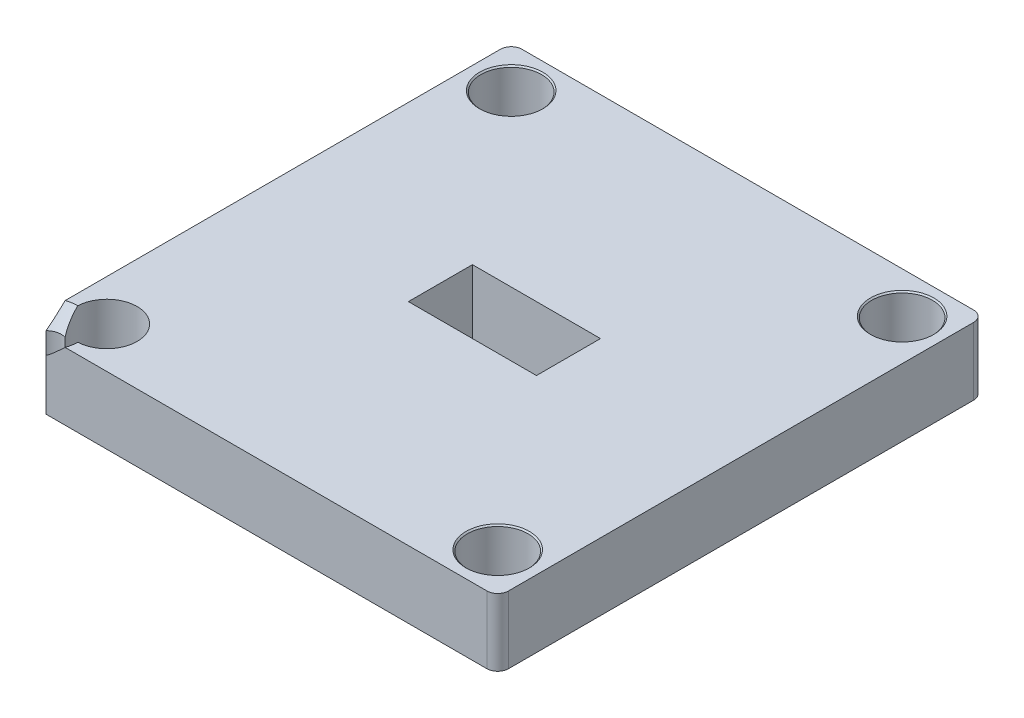
ISO-10303-21;
HEADER;
FILE_DESCRIPTION(('STEP AP214'),'2;1');
FILE_NAME('part.step','',(''),(''),'','','');
FILE_SCHEMA(('AUTOMOTIVE_DESIGN { 1 0 10303 214 1 1 1 1 }'));
ENDSEC;
DATA;
#1=APPLICATION_CONTEXT('core data for automotive mechanical design processes');
#2=APPLICATION_PROTOCOL_DEFINITION('international standard','automotive_design',2000,#1);
#3=PRODUCT_CONTEXT('',#1,'mechanical');
#4=PRODUCT('Part','Part','',(#3));
#5=PRODUCT_RELATED_PRODUCT_CATEGORY('part','',(#4));
#6=PRODUCT_DEFINITION_FORMATION('','',#4);
#7=PRODUCT_DEFINITION_CONTEXT('part definition',#1,'design');
#8=PRODUCT_DEFINITION('design','',#6,#7);
#9=PRODUCT_DEFINITION_SHAPE('','',#8);
#10=(LENGTH_UNIT() NAMED_UNIT(*) SI_UNIT(.MILLI.,.METRE.));
#11=(NAMED_UNIT(*) PLANE_ANGLE_UNIT() SI_UNIT($,.RADIAN.));
#12=(NAMED_UNIT(*) SI_UNIT($,.STERADIAN.) SOLID_ANGLE_UNIT());
#13=UNCERTAINTY_MEASURE_WITH_UNIT(LENGTH_MEASURE(1.E-05),#10,'distance_accuracy_value','');
#14=(GEOMETRIC_REPRESENTATION_CONTEXT(3) GLOBAL_UNCERTAINTY_ASSIGNED_CONTEXT((#13)) GLOBAL_UNIT_ASSIGNED_CONTEXT((#10,
#11,#12)) REPRESENTATION_CONTEXT('',''));
#15=CARTESIAN_POINT('',(0.,0.,0.));
#16=DIRECTION('',(0.,0.,1.));
#17=DIRECTION('',(1.,0.,0.));
#18=AXIS2_PLACEMENT_3D('',#15,#16,#17);
#19=CARTESIAN_POINT('',(-33.5,10.,-34.5));
#20=DIRECTION('',(0.,-1.,0.));
#21=DIRECTION('',(0.,0.,-1.));
#22=AXIS2_PLACEMENT_3D('',#19,#20,#21);
#23=PLANE('',#22);
#24=CARTESIAN_POINT('',(-29.,10.,-30.));
#25=DIRECTION('',(0.,1.,0.));
#26=DIRECTION('',(0.,0.,1.));
#27=AXIS2_PLACEMENT_3D('',#24,#25,#26);
#28=CIRCLE('',#27,4.7);
#29=CARTESIAN_POINT('',(-29.,10.,-25.3));
#30=VERTEX_POINT('',#29);
#31=EDGE_CURVE('E399',#30,#30,#28,.T.);
#32=ORIENTED_EDGE('',*,*,#31,.F.);
#33=EDGE_LOOP('',(#32));
#34=FACE_BOUND('',#33,.T.);
#35=CARTESIAN_POINT('',(29.,10.,-30.));
#36=DIRECTION('',(0.,1.,0.));
#37=DIRECTION('',(0.,0.,1.));
#38=AXIS2_PLACEMENT_3D('',#35,#36,#37);
#39=CIRCLE('',#38,4.7);
#40=CARTESIAN_POINT('',(29.,10.,-25.3));
#41=VERTEX_POINT('',#40);
#42=EDGE_CURVE('E393',#41,#41,#39,.T.);
#43=ORIENTED_EDGE('',*,*,#42,.F.);
#44=EDGE_LOOP('',(#43));
#45=FACE_BOUND('',#44,.T.);
#46=DIRECTION('',(0.,0.,-1.));
#47=VECTOR('',#46,1.);
#48=CARTESIAN_POINT('',(9.5,10.,4.75));
#49=LINE('',#48,#47);
#50=CARTESIAN_POINT('',(9.5,10.,4.75));
#51=VERTEX_POINT('',#50);
#52=CARTESIAN_POINT('',(9.5,10.,-4.75));
#53=VERTEX_POINT('',#52);
#54=EDGE_CURVE('E337',#51,#53,#49,.T.);
#55=ORIENTED_EDGE('',*,*,#54,.F.);
#56=DIRECTION('',(1.,0.,0.));
#57=VECTOR('',#56,1.);
#58=CARTESIAN_POINT('',(-9.5,10.,4.75));
#59=LINE('',#58,#57);
#60=CARTESIAN_POINT('',(-9.5,10.,4.75));
#61=VERTEX_POINT('',#60);
#62=EDGE_CURVE('E345',#61,#51,#59,.T.);
#63=ORIENTED_EDGE('',*,*,#62,.F.);
#64=DIRECTION('',(0.,0.,1.));
#65=VECTOR('',#64,1.);
#66=CARTESIAN_POINT('',(-9.5,10.,4.75));
#67=LINE('',#66,#65);
#68=CARTESIAN_POINT('',(-9.5,10.,-4.75));
#69=VERTEX_POINT('',#68);
#70=EDGE_CURVE('E342',#69,#61,#67,.T.);
#71=ORIENTED_EDGE('',*,*,#70,.F.);
#72=DIRECTION('',(-1.,0.,0.));
#73=VECTOR('',#72,1.);
#74=CARTESIAN_POINT('',(-9.5,10.,-4.75));
#75=LINE('',#74,#73);
#76=EDGE_CURVE('E339',#53,#69,#75,.T.);
#77=ORIENTED_EDGE('',*,*,#76,.F.);
#78=EDGE_LOOP('',(#55,#63,#71,#77));
#79=FACE_BOUND('',#78,.T.);
#80=CARTESIAN_POINT('',(29.0000000000008,10.,30.));
#81=DIRECTION('',(0.,1.,0.));
#82=DIRECTION('',(0.,0.,1.));
#83=AXIS2_PLACEMENT_3D('',#80,#81,#82);
#84=CIRCLE('',#83,4.7);
#85=CARTESIAN_POINT('',(29.0000000000008,10.,34.7));
#86=VERTEX_POINT('',#85);
#87=EDGE_CURVE('E164',#86,#86,#84,.T.);
#88=ORIENTED_EDGE('',*,*,#87,.F.);
#89=EDGE_LOOP('',(#88));
#90=FACE_BOUND('',#89,.T.);
#91=CARTESIAN_POINT('',(-33.5,10.,34.5));
#92=DIRECTION('',(0.,1.,0.));
#93=DIRECTION('',(0.,0.,1.));
#94=AXIS2_PLACEMENT_3D('',#91,#92,#93);
#95=CIRCLE('',#94,4.7);
#96=CARTESIAN_POINT('',(-29.0807240412031,10.,36.1));
#97=VERTEX_POINT('',#96);
#98=CARTESIAN_POINT('',(-28.8000021033821,10.,34.4955534521735));
#99=VERTEX_POINT('',#98);
#100=EDGE_CURVE('E57',#97,#99,#95,.T.);
#101=ORIENTED_EDGE('',*,*,#100,.F.);
#102=DIRECTION('',(1.,0.,0.));
#103=VECTOR('',#102,1.);
#104=CARTESIAN_POINT('',(33.5,10.,36.1));
#105=LINE('',#104,#103);
#106=CARTESIAN_POINT('',(33.5,10.,36.1));
#107=VERTEX_POINT('',#106);
#108=EDGE_CURVE('E163',#97,#107,#105,.T.);
#109=ORIENTED_EDGE('',*,*,#108,.T.);
#110=CARTESIAN_POINT('',(33.5,10.,34.5));
#111=DIRECTION('',(0.,1.,0.));
#112=DIRECTION('',(0.,0.,1.));
#113=AXIS2_PLACEMENT_3D('',#110,#111,#112);
#114=CIRCLE('',#113,1.6);
#115=CARTESIAN_POINT('',(35.1,10.,34.5));
#116=VERTEX_POINT('',#115);
#117=EDGE_CURVE('E374',#107,#116,#114,.T.);
#118=ORIENTED_EDGE('',*,*,#117,.T.);
#119=DIRECTION('',(0.,0.,-1.));
#120=VECTOR('',#119,1.);
#121=CARTESIAN_POINT('',(35.1,10.,34.5));
#122=LINE('',#121,#120);
#123=CARTESIAN_POINT('',(35.1,10.,-34.5));
#124=VERTEX_POINT('',#123);
#125=EDGE_CURVE('E292',#116,#124,#122,.T.);
#126=ORIENTED_EDGE('',*,*,#125,.T.);
#127=CARTESIAN_POINT('',(33.5,10.,-34.5));
#128=DIRECTION('',(0.,1.,0.));
#129=DIRECTION('',(0.,0.,1.));
#130=AXIS2_PLACEMENT_3D('',#127,#128,#129);
#131=CIRCLE('',#130,1.59999999999999);
#132=CARTESIAN_POINT('',(33.5,10.,-36.1));
#133=VERTEX_POINT('',#132);
#134=EDGE_CURVE('E377',#124,#133,#131,.T.);
#135=ORIENTED_EDGE('',*,*,#134,.T.);
#136=DIRECTION('',(-1.,0.,0.));
#137=VECTOR('',#136,1.);
#138=CARTESIAN_POINT('',(33.5,10.,-36.1));
#139=LINE('',#138,#137);
#140=CARTESIAN_POINT('',(-33.5,10.,-36.1));
#141=VERTEX_POINT('',#140);
#142=EDGE_CURVE('E309',#133,#141,#139,.T.);
#143=ORIENTED_EDGE('',*,*,#142,.T.);
#144=CARTESIAN_POINT('',(-33.5,10.,-34.5));
#145=DIRECTION('',(0.,1.,0.));
#146=DIRECTION('',(0.,0.,-1.));
#147=AXIS2_PLACEMENT_3D('',#144,#145,#146);
#148=CIRCLE('',#147,1.59999999999999);
#149=CARTESIAN_POINT('',(-35.1,10.,-34.5));
#150=VERTEX_POINT('',#149);
#151=EDGE_CURVE('E304',#141,#150,#148,.T.);
#152=ORIENTED_EDGE('',*,*,#151,.T.);
#153=DIRECTION('',(0.,0.,1.));
#154=VECTOR('',#153,1.);
#155=CARTESIAN_POINT('',(-35.1,10.,34.5));
#156=LINE('',#155,#154);
#157=CARTESIAN_POINT('',(-35.1,10.,30.0807240412031));
#158=VERTEX_POINT('',#157);
#159=EDGE_CURVE('E370',#150,#158,#156,.T.);
#160=ORIENTED_EDGE('',*,*,#159,.T.);
#161=CARTESIAN_POINT('',(-33.4955534521726,10.,29.8000021033821));
#162=VERTEX_POINT('',#161);
#163=EDGE_CURVE('E392',#162,#158,#95,.T.);
#164=ORIENTED_EDGE('',*,*,#163,.F.);
#165=CARTESIAN_POINT('',(-28.9999999999992,10.,30.));
#166=DIRECTION('',(0.,1.,0.));
#167=DIRECTION('',(0.,0.,1.));
#168=AXIS2_PLACEMENT_3D('',#165,#166,#167);
#169=CIRCLE('',#168,4.5);
#170=EDGE_CURVE('E321',#99,#162,#169,.T.);
#171=ORIENTED_EDGE('',*,*,#170,.F.);
#172=EDGE_LOOP('',(#101,#109,#118,#126,#135,#143,#152,#160,#164,#171));
#173=FACE_BOUND('',#172,.T.);
#174=ADVANCED_FACE('F33',(#34,#45,#79,#90,#173),#23,.F.);
#175=CARTESIAN_POINT('',(-33.5,0.,-34.5));
#176=DIRECTION('',(0.,-1.,0.));
#177=DIRECTION('',(0.,0.,-1.));
#178=AXIS2_PLACEMENT_3D('',#175,#176,#177);
#179=PLANE('',#178);
#180=CARTESIAN_POINT('',(29.0000000000008,0.,30.));
#181=DIRECTION('',(0.,1.,0.));
#182=DIRECTION('',(0.,0.,1.));
#183=AXIS2_PLACEMENT_3D('',#180,#181,#182);
#184=CIRCLE('',#183,4.5);
#185=CARTESIAN_POINT('',(29.0000000000008,0.,34.5));
#186=VERTEX_POINT('',#185);
#187=EDGE_CURVE('E326',#186,#186,#184,.T.);
#188=ORIENTED_EDGE('',*,*,#187,.T.);
#189=EDGE_LOOP('',(#188));
#190=FACE_BOUND('',#189,.T.);
#191=CARTESIAN_POINT('',(-29.,0.,-30.));
#192=DIRECTION('',(0.,1.,0.));
#193=DIRECTION('',(0.,0.,1.));
#194=AXIS2_PLACEMENT_3D('',#191,#192,#193);
#195=CIRCLE('',#194,4.5);
#196=CARTESIAN_POINT('',(-29.,0.,-25.5));
#197=VERTEX_POINT('',#196);
#198=EDGE_CURVE('E333',#197,#197,#195,.T.);
#199=ORIENTED_EDGE('',*,*,#198,.T.);
#200=EDGE_LOOP('',(#199));
#201=FACE_BOUND('',#200,.T.);
#202=DIRECTION('',(1.,0.,0.));
#203=VECTOR('',#202,1.);
#204=CARTESIAN_POINT('',(-9.5,0.,4.75));
#205=LINE('',#204,#203);
#206=CARTESIAN_POINT('',(-9.5,0.,4.75));
#207=VERTEX_POINT('',#206);
#208=CARTESIAN_POINT('',(9.49999999999999,0.,4.75));
#209=VERTEX_POINT('',#208);
#210=EDGE_CURVE('E340',#207,#209,#205,.T.);
#211=ORIENTED_EDGE('',*,*,#210,.T.);
#212=DIRECTION('',(0.,0.,-1.));
#213=VECTOR('',#212,1.);
#214=CARTESIAN_POINT('',(9.5,0.,4.75));
#215=LINE('',#214,#213);
#216=CARTESIAN_POINT('',(9.5,0.,-4.75));
#217=VERTEX_POINT('',#216);
#218=EDGE_CURVE('E336',#209,#217,#215,.T.);
#219=ORIENTED_EDGE('',*,*,#218,.T.);
#220=DIRECTION('',(-1.,0.,0.));
#221=VECTOR('',#220,1.);
#222=CARTESIAN_POINT('',(-9.5,0.,-4.75));
#223=LINE('',#222,#221);
#224=CARTESIAN_POINT('',(-9.5,0.,-4.75));
#225=VERTEX_POINT('',#224);
#226=EDGE_CURVE('E350',#217,#225,#223,.T.);
#227=ORIENTED_EDGE('',*,*,#226,.T.);
#228=DIRECTION('',(0.,0.,1.));
#229=VECTOR('',#228,1.);
#230=CARTESIAN_POINT('',(-9.5,0.,4.75));
#231=LINE('',#230,#229);
#232=EDGE_CURVE('E353',#225,#207,#231,.T.);
#233=ORIENTED_EDGE('',*,*,#232,.T.);
#234=EDGE_LOOP('',(#211,#219,#227,#233));
#235=FACE_BOUND('',#234,.T.);
#236=CARTESIAN_POINT('',(29.,0.,-30.));
#237=DIRECTION('',(0.,1.,0.));
#238=DIRECTION('',(0.,0.,1.));
#239=AXIS2_PLACEMENT_3D('',#236,#237,#238);
#240=CIRCLE('',#239,4.5);
#241=CARTESIAN_POINT('',(29.,0.,-25.5));
#242=VERTEX_POINT('',#241);
#243=EDGE_CURVE('E330',#242,#242,#240,.T.);
#244=ORIENTED_EDGE('',*,*,#243,.T.);
#245=EDGE_LOOP('',(#244));
#246=FACE_BOUND('',#245,.T.);
#247=DIRECTION('',(1.,0.,0.));
#248=VECTOR('',#247,1.);
#249=CARTESIAN_POINT('',(33.5,0.,36.1));
#250=LINE('',#249,#248);
#251=CARTESIAN_POINT('',(-31.9180707980444,0.,36.1));
#252=VERTEX_POINT('',#251);
#253=CARTESIAN_POINT('',(33.5,0.,36.1));
#254=VERTEX_POINT('',#253);
#255=EDGE_CURVE('E288',#252,#254,#250,.T.);
#256=ORIENTED_EDGE('',*,*,#255,.F.);
#257=CARTESIAN_POINT('',(-33.5,0.,34.5));
#258=DIRECTION('',(0.,1.,0.));
#259=DIRECTION('',(0.,0.,1.));
#260=AXIS2_PLACEMENT_3D('',#257,#258,#259);
#261=CIRCLE('',#260,2.25);
#262=CARTESIAN_POINT('',(-31.3496324437633,0.,33.8378675562363));
#263=VERTEX_POINT('',#262);
#264=EDGE_CURVE('E151',#252,#263,#261,.T.);
#265=ORIENTED_EDGE('',*,*,#264,.T.);
#266=CARTESIAN_POINT('',(-28.9999999999992,0.,30.));
#267=DIRECTION('',(0.,1.,0.));
#268=DIRECTION('',(0.,0.,1.));
#269=AXIS2_PLACEMENT_3D('',#266,#267,#268);
#270=CIRCLE('',#269,4.5);
#271=CARTESIAN_POINT('',(-32.8378675562359,0.,32.3496324437634));
#272=VERTEX_POINT('',#271);
#273=EDGE_CURVE('E317',#263,#272,#270,.T.);
#274=ORIENTED_EDGE('',*,*,#273,.T.);
#275=CARTESIAN_POINT('',(-35.1,0.,32.9180707980443));
#276=VERTEX_POINT('',#275);
#277=EDGE_CURVE('E158',#272,#276,#261,.T.);
#278=ORIENTED_EDGE('',*,*,#277,.T.);
#279=DIRECTION('',(0.,0.,1.));
#280=VECTOR('',#279,1.);
#281=CARTESIAN_POINT('',(-35.1,0.,34.5));
#282=LINE('',#281,#280);
#283=CARTESIAN_POINT('',(-35.1,0.,-34.5));
#284=VERTEX_POINT('',#283);
#285=EDGE_CURVE('E382',#284,#276,#282,.T.);
#286=ORIENTED_EDGE('',*,*,#285,.F.);
#287=CARTESIAN_POINT('',(-33.5,0.,-34.5));
#288=DIRECTION('',(0.,1.,0.));
#289=DIRECTION('',(0.,0.,-1.));
#290=AXIS2_PLACEMENT_3D('',#287,#288,#289);
#291=CIRCLE('',#290,1.59999999999999);
#292=CARTESIAN_POINT('',(-33.5,0.,-36.1));
#293=VERTEX_POINT('',#292);
#294=EDGE_CURVE('E367',#293,#284,#291,.T.);
#295=ORIENTED_EDGE('',*,*,#294,.F.);
#296=DIRECTION('',(-1.,0.,0.));
#297=VECTOR('',#296,1.);
#298=CARTESIAN_POINT('',(33.5,0.,-36.1));
#299=LINE('',#298,#297);
#300=CARTESIAN_POINT('',(33.5,0.,-36.1));
#301=VERTEX_POINT('',#300);
#302=EDGE_CURVE('E299',#301,#293,#299,.T.);
#303=ORIENTED_EDGE('',*,*,#302,.F.);
#304=CARTESIAN_POINT('',(33.5,0.,-34.5));
#305=DIRECTION('',(0.,1.,0.));
#306=DIRECTION('',(0.,0.,1.));
#307=AXIS2_PLACEMENT_3D('',#304,#305,#306);
#308=CIRCLE('',#307,1.59999999999999);
#309=CARTESIAN_POINT('',(35.1,0.,-34.5));
#310=VERTEX_POINT('',#309);
#311=EDGE_CURVE('E297',#310,#301,#308,.T.);
#312=ORIENTED_EDGE('',*,*,#311,.F.);
#313=DIRECTION('',(0.,0.,-1.));
#314=VECTOR('',#313,1.);
#315=CARTESIAN_POINT('',(35.1,0.,34.5));
#316=LINE('',#315,#314);
#317=CARTESIAN_POINT('',(35.1,0.,34.5));
#318=VERTEX_POINT('',#317);
#319=EDGE_CURVE('E287',#318,#310,#316,.T.);
#320=ORIENTED_EDGE('',*,*,#319,.F.);
#321=CARTESIAN_POINT('',(33.5,0.,34.5));
#322=DIRECTION('',(0.,1.,0.));
#323=DIRECTION('',(0.,0.,1.));
#324=AXIS2_PLACEMENT_3D('',#321,#322,#323);
#325=CIRCLE('',#324,1.6);
#326=EDGE_CURVE('E279',#254,#318,#325,.T.);
#327=ORIENTED_EDGE('',*,*,#326,.F.);
#328=EDGE_LOOP('',(#256,#265,#274,#278,#286,#295,#303,#312,#320,#327));
#329=FACE_BOUND('',#328,.T.);
#330=ADVANCED_FACE('F254',(#190,#201,#235,#246,#329),#179,.T.);
#331=CARTESIAN_POINT('',(-33.5,10.,-34.5));
#332=DIRECTION('',(0.,-1.,0.));
#333=DIRECTION('',(0.,0.,-1.));
#334=AXIS2_PLACEMENT_3D('',#331,#332,#333);
#335=CYLINDRICAL_SURFACE('',#334,1.59999999999999);
#336=ORIENTED_EDGE('',*,*,#294,.T.);
#337=DIRECTION('',(0.,-1.,0.));
#338=VECTOR('',#337,1.);
#339=CARTESIAN_POINT('',(-35.1,10.,-34.5));
#340=LINE('',#339,#338);
#341=EDGE_CURVE('E314',#150,#284,#340,.T.);
#342=ORIENTED_EDGE('',*,*,#341,.F.);
#343=ORIENTED_EDGE('',*,*,#151,.F.);
#344=DIRECTION('',(0.,-1.,0.));
#345=VECTOR('',#344,1.);
#346=CARTESIAN_POINT('',(-33.5,10.,-36.1));
#347=LINE('',#346,#345);
#348=EDGE_CURVE('E305',#141,#293,#347,.T.);
#349=ORIENTED_EDGE('',*,*,#348,.T.);
#350=EDGE_LOOP('',(#336,#342,#343,#349));
#351=FACE_BOUND('',#350,.T.);
#352=ADVANCED_FACE('F35',(#351),#335,.T.);
#353=CARTESIAN_POINT('',(-35.1,10.,34.5));
#354=DIRECTION('',(1.,0.,0.));
#355=DIRECTION('',(0.,0.,-1.));
#356=AXIS2_PLACEMENT_3D('',#353,#354,#355);
#357=PLANE('',#356);
#358=ORIENTED_EDGE('',*,*,#285,.T.);
#359=DIRECTION('',(0.,1.,0.));
#360=VECTOR('',#359,1.);
#361=CARTESIAN_POINT('',(-35.1,10.,32.9180707980443));
#362=LINE('',#361,#360);
#363=CARTESIAN_POINT('',(-35.1,7.55,32.9180707980443));
#364=VERTEX_POINT('',#363);
#365=EDGE_CURVE('E42',#276,#364,#362,.T.);
#366=ORIENTED_EDGE('',*,*,#365,.T.);
#367=CARTESIAN_POINT('',(-35.1,8.86013652780374,37.6803415062855));
#368=CARTESIAN_POINT('',(-35.1,8.77733782285125,37.5876239203432));
#369=CARTESIAN_POINT('',(-35.1,8.69491360798095,37.4945659676747));
#370=CARTESIAN_POINT('',(-35.1,8.53108985817881,37.3074959067979));
#371=CARTESIAN_POINT('',(-35.1,8.44969069158764,37.2134834763586));
#372=CARTESIAN_POINT('',(-35.1,8.28724554280264,37.0231171866043));
#373=CARTESIAN_POINT('',(-35.1,8.20621659129305,36.9267487486623));
#374=CARTESIAN_POINT('',(-35.1,8.04606450387914,36.7324659471347));
#375=CARTESIAN_POINT('',(-35.1,7.96694100214349,36.6345518863699));
#376=CARTESIAN_POINT('',(-35.1,7.8161935318653,36.4428122006294));
#377=CARTESIAN_POINT('',(-35.1,7.74440973331779,36.3491128922721));
#378=CARTESIAN_POINT('',(-35.1,7.60414927461362,36.1592788558065));
#379=CARTESIAN_POINT('',(-35.1,7.53567200092891,36.0631445845934));
#380=CARTESIAN_POINT('',(-35.1,7.4037545948027,35.8678319026889));
#381=CARTESIAN_POINT('',(-35.1,7.34030070544254,35.7686629156289));
#382=CARTESIAN_POINT('',(-35.1,7.22084765120285,35.5660097045423));
#383=CARTESIAN_POINT('',(-35.1,7.16483970094342,35.462530758645));
#384=CARTESIAN_POINT('',(-35.1,7.06807585154756,35.2573896431176));
#385=CARTESIAN_POINT('',(-35.1,7.02651683221369,35.1561246624282));
#386=CARTESIAN_POINT('',(-35.1,6.97577397561519,35.0006025831752));
#387=CARTESIAN_POINT('',(-35.1,6.96080610230213,34.9482389971205));
#388=CARTESIAN_POINT('',(-35.1,6.93542826587573,34.8424322453631));
#389=CARTESIAN_POINT('',(-35.1,6.92501544219765,34.7889897793224));
#390=CARTESIAN_POINT('',(-35.1,6.90923568034392,34.6804577192889));
#391=CARTESIAN_POINT('',(-35.1,6.90395397835953,34.6253554802438));
#392=CARTESIAN_POINT('',(-35.1,6.89911830568692,34.5149016307532));
#393=CARTESIAN_POINT('',(-35.1,6.89956363607579,34.459550051561));
#394=CARTESIAN_POINT('',(-35.1,6.90614999282467,34.3491390070471));
#395=CARTESIAN_POINT('',(-35.1,6.91229661220243,34.2940798819773));
#396=CARTESIAN_POINT('',(-35.1,6.92985623389784,34.1848106472106));
#397=CARTESIAN_POINT('',(-35.1,6.94127081009647,34.130600796255));
#398=CARTESIAN_POINT('',(-35.1,6.97262123870841,34.0079449538819));
#399=CARTESIAN_POINT('',(-35.1,6.9940635197176,33.9398872681556));
#400=CARTESIAN_POINT('',(-35.1,7.04292307336316,33.8059688585622));
#401=CARTESIAN_POINT('',(-35.1,7.07034346483699,33.7401093022388));
#402=CARTESIAN_POINT('',(-35.1,7.12989436165749,33.6101293457943));
#403=CARTESIAN_POINT('',(-35.1,7.16205086055498,33.5460210194774));
#404=CARTESIAN_POINT('',(-35.1,7.2298181543728,33.4197050001715));
#405=CARTESIAN_POINT('',(-35.1,7.26542785162559,33.3574967114321));
#406=CARTESIAN_POINT('',(-35.1,7.34309047191059,33.2283274347889));
#407=CARTESIAN_POINT('',(-35.1,7.38542898777782,33.1615393571807));
#408=CARTESIAN_POINT('',(-35.1,7.47250837109463,33.0295408233452));
#409=CARTESIAN_POINT('',(-35.1,7.51724972499184,32.9643306904739));
#410=CARTESIAN_POINT('',(-35.1,7.60859590298105,32.8351570615612));
#411=CARTESIAN_POINT('',(-35.1,7.65520217749516,32.7711945957323));
#412=CARTESIAN_POINT('',(-35.1,7.74984199711222,32.6443320092789));
#413=CARTESIAN_POINT('',(-35.1,7.797875638054,32.581431960436));
#414=CARTESIAN_POINT('',(-35.1,7.94391425289177,32.3936951758693));
#415=CARTESIAN_POINT('',(-35.1,8.04360467680391,32.2701711615635));
#416=CARTESIAN_POINT('',(-35.1,8.24584023302992,32.0255984637978));
#417=CARTESIAN_POINT('',(-35.1,8.34838407869698,31.9045487060409));
#418=CARTESIAN_POINT('',(-35.1,8.55594569169108,31.663640000249));
#419=CARTESIAN_POINT('',(-35.1,8.66097253179608,31.5437888866151));
#420=CARTESIAN_POINT('',(-35.1,8.87248926014517,31.3053662594991));
#421=CARTESIAN_POINT('',(-35.1,8.97897930132574,31.186794882126));
#422=CARTESIAN_POINT('',(-35.1,9.29967555689006,30.832924276474));
#423=CARTESIAN_POINT('',(-35.1,9.51546441848529,30.5990607075291));
#424=CARTESIAN_POINT('',(-35.1,9.87481879292479,30.2137536258128));
#425=CARTESIAN_POINT('',(-35.1,10.0176786100443,30.0616474690406));
#426=CARTESIAN_POINT('',(-35.1,10.3042133653982,29.7582009209606));
#427=CARTESIAN_POINT('',(-35.1,10.4478883128689,29.6068605383666));
#428=CARTESIAN_POINT('',(-35.1,10.8799965415489,29.1535272317029));
#429=CARTESIAN_POINT('',(-35.1,11.169342028978,28.8524046547898));
#430=CARTESIAN_POINT('',(-35.1,11.7451964282903,28.2560916173587));
#431=CARTESIAN_POINT('',(-35.1,12.0316831851946,27.9608797165355));
#432=CARTESIAN_POINT('',(-35.1,12.4620541851914,27.5188728711518));
#433=CARTESIAN_POINT('',(-35.1,12.6055712313032,27.3717201346596));
#434=CARTESIAN_POINT('',(-35.1,12.8928112968325,27.0776165830454));
#435=CARTESIAN_POINT('',(-35.1,13.0365343156955,26.9306657673819));
#436=CARTESIAN_POINT('',(-35.1,13.1803415062855,26.7837974199943));
#437=B_SPLINE_CURVE_WITH_KNOTS('',3,(#367,#368,#369,#370,#371,#372,#373,#374,#375,#376,#377,
#378,#379,#380,#381,#382,#383,#384,#385,#386,#387,#388,#389,#390,#391,#392,#393,#394,#395,#396,
#397,#398,#399,#400,#401,#402,#403,#404,#405,#406,#407,#408,#409,#410,#411,#412,#413,#414,#415,
#416,#417,#418,#419,#420,#421,#422,#423,#424,#425,#426,#427,#428,#429,#430,#431,#432,#433,#434,
#435,#436),.UNSPECIFIED.,.F.,.F.,(4,2,2,2,2,2,2,2,2,2,2,2,2,2,2,2,2,2,2,2,2,2,2,2,2,2,2,2,2,2,2,
2,2,2,4),(0.,0.37292598720667,0.745982362658615,1.12368587004931,1.50131627369463,
1.85537412907165,2.20936603430463,2.56235231710056,2.91491834735072,3.24232816566642,
3.40554439102795,3.56865796916462,3.73443701226032,3.90019582399269,4.06611741884641,
4.23208861738401,4.44578058369297,4.65958430307132,4.87460849245409,5.0895645547927,
5.3267268074318,5.56393725521654,5.80133592016885,6.038750561151,6.51487167691808,
6.99078147519498,7.46883797796114,7.94694483403113,8.90153367380364,9.52755703138766,
10.1535874966636,11.4063990649824,12.6405043163538,13.2571560974969,13.8738062215348),.UNSPECIFIED.);
#438=EDGE_CURVE('E165',#364,#158,#437,.T.);
#439=ORIENTED_EDGE('',*,*,#438,.T.);
#440=ORIENTED_EDGE('',*,*,#159,.F.);
#441=ORIENTED_EDGE('',*,*,#341,.T.);
#442=EDGE_LOOP('',(#358,#366,#439,#440,#441));
#443=FACE_BOUND('',#442,.T.);
#444=ADVANCED_FACE('F275',(#443),#357,.F.);
#445=CARTESIAN_POINT('',(33.5,10.,36.1));
#446=DIRECTION('',(0.,0.,-1.));
#447=DIRECTION('',(-1.,0.,0.));
#448=AXIS2_PLACEMENT_3D('',#445,#446,#447);
#449=PLANE('',#448);
#450=CARTESIAN_POINT('',(-25.7837974199943,13.1803415062855,36.1));
#451=CARTESIAN_POINT('',(-25.9686238284718,12.9993729773435,36.1));
#452=CARTESIAN_POINT('',(-26.1535766182805,12.8185332036205,36.1));
#453=CARTESIAN_POINT('',(-26.5241275002585,12.4568938497594,36.1));
#454=CARTESIAN_POINT('',(-26.7097261544509,12.2760948455815,36.1));
#455=CARTESIAN_POINT('',(-27.0865481582018,11.9098674256074,36.1));
#456=CARTESIAN_POINT('',(-27.2777833981196,11.7244512384391,36.1));
#457=CARTESIAN_POINT('',(-27.6605053062373,11.3545262594831,36.1));
#458=CARTESIAN_POINT('',(-27.8519910035463,11.1700164638301,36.1));
#459=CARTESIAN_POINT('',(-28.2300848175222,10.8072005074122,36.1));
#460=CARTESIAN_POINT('',(-28.4166708925506,10.628871391669,36.1));
#461=CARTESIAN_POINT('',(-28.7908526788268,10.2731960998605,36.1));
#462=CARTESIAN_POINT('',(-28.978448591492,10.0958501353785,36.1));
#463=CARTESIAN_POINT('',(-29.3563160331871,9.74137368153516,36.1));
#464=CARTESIAN_POINT('',(-29.5465970984982,9.56425334746923,36.1));
#465=CARTESIAN_POINT('',(-29.9290116382949,9.21232686453438,36.1));
#466=CARTESIAN_POINT('',(-30.121143478471,9.03751894893245,36.1));
#467=CARTESIAN_POINT('',(-30.4090356627717,8.7802732155095,36.1));
#468=CARTESIAN_POINT('',(-30.5036086713876,8.69650775380672,36.1));
#469=CARTESIAN_POINT('',(-30.6936946734011,8.53005157004566,36.1));
#470=CARTESIAN_POINT('',(-30.7892076492002,8.44736082793301,36.1));
#471=CARTESIAN_POINT('',(-30.9817538245845,8.2831239709801,36.1));
#472=CARTESIAN_POINT('',(-31.0787909623441,8.20158246140052,36.1));
#473=CARTESIAN_POINT('',(-31.274442484336,8.04044194503405,36.1));
#474=CARTESIAN_POINT('',(-31.3730565791915,7.96084258847572,36.1));
#475=CARTESIAN_POINT('',(-31.5710427390841,7.80542587595867,36.1));
#476=CARTESIAN_POINT('',(-31.6703856070532,7.72957150689404,36.1));
#477=CARTESIAN_POINT('',(-31.8719825958948,7.58160855948994,36.1));
#478=CARTESIAN_POINT('',(-31.9742390384591,7.50950310548128,36.1));
#479=CARTESIAN_POINT('',(-32.1820490271168,7.37146613569216,36.1));
#480=CARTESIAN_POINT('',(-32.2875810505914,7.30550248599193,36.1));
#481=CARTESIAN_POINT('',(-32.5037796396183,7.18269601918276,36.1));
#482=CARTESIAN_POINT('',(-32.6144353345116,7.12583493848056,36.1));
#483=CARTESIAN_POINT('',(-32.7524947735511,7.06586975255465,36.1));
#484=CARTESIAN_POINT('',(-32.7768418693434,7.05569232146494,36.1));
#485=CARTESIAN_POINT('',(-32.8258471269373,7.03608058509546,36.1));
#486=CARTESIAN_POINT('',(-32.8505054200345,7.02664660652918,36.1));
#487=CARTESIAN_POINT('',(-32.9001200585669,7.00860253939671,36.1));
#488=CARTESIAN_POINT('',(-32.9250763737734,6.99999236805615,36.1));
#489=CARTESIAN_POINT('',(-32.9752802161708,6.98367659165028,36.1));
#490=CARTESIAN_POINT('',(-33.0005277256763,6.97597093196481,36.1));
#491=CARTESIAN_POINT('',(-33.0757522173027,6.95460139839271,36.1));
#492=CARTESIAN_POINT('',(-33.1261405522018,6.94234180315141,36.1));
#493=CARTESIAN_POINT('',(-33.227813889293,6.92222169874745,36.1));
#494=CARTESIAN_POINT('',(-33.2790991739374,6.91436260200741,36.1));
#495=CARTESIAN_POINT('',(-33.3831547658465,6.90341172116034,36.1));
#496=CARTESIAN_POINT('',(-33.4359349381828,6.90041149122858,36.1));
#497=CARTESIAN_POINT('',(-33.5415165128721,6.89966795105232,36.1));
#498=CARTESIAN_POINT('',(-33.5943179042727,6.90192308061917,36.1));
#499=CARTESIAN_POINT('',(-33.6996465279518,6.91155090177062,36.1));
#500=CARTESIAN_POINT('',(-33.7521719531814,6.91894302860359,36.1));
#501=CARTESIAN_POINT('',(-33.8563569149292,6.93840364913715,36.1));
#502=CARTESIAN_POINT('',(-33.908016024126,6.95047438371701,36.1));
#503=CARTESIAN_POINT('',(-34.0305347133439,6.98426625069947,36.1));
#504=CARTESIAN_POINT('',(-34.1008595546921,7.00791617527883,36.1));
#505=CARTESIAN_POINT('',(-34.2391371399999,7.06131877292527,36.1));
#506=CARTESIAN_POINT('',(-34.3070883736748,7.09107525159714,36.1));
#507=CARTESIAN_POINT('',(-34.4414960216786,7.15550492465309,36.1));
#508=CARTESIAN_POINT('',(-34.5079282536966,7.19022791078575,36.1));
#509=CARTESIAN_POINT('',(-34.6388090819203,7.26314479073433,36.1));
#510=CARTESIAN_POINT('',(-34.7032582862467,7.3013376059913,36.1));
#511=CARTESIAN_POINT('',(-34.8563093179371,7.39634087728858,36.1));
#512=CARTESIAN_POINT('',(-34.9441164399191,7.45442460119242,36.1));
#513=CARTESIAN_POINT('',(-35.1172893638999,7.57414237875221,36.1));
#514=CARTESIAN_POINT('',(-35.2026542979211,7.63577767177714,36.1));
#515=CARTESIAN_POINT('',(-35.3716374226403,7.76167595553601,36.1));
#516=CARTESIAN_POINT('',(-35.4552524422679,7.8259431816135,36.1));
#517=CARTESIAN_POINT('',(-35.6210222808574,7.95633581680157,36.1));
#518=CARTESIAN_POINT('',(-35.7031770096784,8.02246133997555,36.1));
#519=CARTESIAN_POINT('',(-35.8610979289897,8.15181854597462,36.1));
#520=CARTESIAN_POINT('',(-35.9369355325478,8.21496330785866,36.1));
#521=CARTESIAN_POINT('',(-36.0878024503676,8.34221654477524,36.1));
#522=CARTESIAN_POINT('',(-36.1628317270357,8.4063250643008,36.1));
#523=CARTESIAN_POINT('',(-36.3119189066295,8.53503870896419,36.1));
#524=CARTESIAN_POINT('',(-36.3859795495324,8.5996406662216,36.1));
#525=CARTESIAN_POINT('',(-36.5335468324729,8.72945976260345,36.1));
#526=CARTESIAN_POINT('',(-36.607053527363,8.79467683933913,36.1));
#527=CARTESIAN_POINT('',(-36.6803415062855,8.86013652780374,36.1));
#528=B_SPLINE_CURVE_WITH_KNOTS('',3,(#450,#451,#452,#453,#454,#455,#456,#457,#458,#459,#460,
#461,#462,#463,#464,#465,#466,#467,#468,#469,#470,#471,#472,#473,#474,#475,#476,#477,#478,#479,
#480,#481,#482,#483,#484,#485,#486,#487,#488,#489,#490,#491,#492,#493,#494,#495,#496,#497,#498,
#499,#500,#501,#502,#503,#504,#505,#506,#507,#508,#509,#510,#511,#512,#513,#514,#515,#516,#517,
#518,#519,#520,#521,#522,#523,#524,#525,#526,#527),.UNSPECIFIED.,.F.,.F.,(4,2,2,2,2,2,2,2,2,2,2,
2,2,2,2,2,2,2,2,2,2,2,2,2,2,2,2,2,2,2,2,2,2,2,2,2,2,2,4),(0.,0.776011669517539,1.55332467998232,
2.35241740130574,3.15015984265896,3.92445741783092,4.6989156195367,5.47878267901064,
6.25801479369055,6.63701596357637,7.01601005108426,7.39623852733761,7.77639801332485,
8.15131599655987,8.52654158477349,8.89967841361965,9.27205692613575,9.35121297488318,
9.43040361734208,9.50958629452088,9.58876418768493,9.744155161039,9.89959598149479,
10.0579330155483,10.2162230491689,10.3751152390291,10.5340836265745,10.7562743804444,
10.9786040264102,11.203343262678,11.4280128786446,11.7437156153769,12.0595291960811,
12.3758726613959,12.6922355866589,12.9882789770726,13.2843360769108,13.579163717362,
13.8739617696475),.UNSPECIFIED.);
#529=CARTESIAN_POINT('',(-31.9180707980444,7.55,36.1));
#530=VERTEX_POINT('',#529);
#531=EDGE_CURVE('E156',#97,#530,#528,.T.);
#532=ORIENTED_EDGE('',*,*,#531,.T.);
#533=DIRECTION('',(0.,1.,0.));
#534=VECTOR('',#533,1.);
#535=CARTESIAN_POINT('',(-31.9180707980444,10.,36.1));
#536=LINE('',#535,#534);
#537=EDGE_CURVE('E11',#530,#252,#536,.F.);
#538=ORIENTED_EDGE('',*,*,#537,.T.);
#539=ORIENTED_EDGE('',*,*,#255,.T.);
#540=DIRECTION('',(0.,-1.,0.));
#541=VECTOR('',#540,1.);
#542=CARTESIAN_POINT('',(33.5,10.,36.1));
#543=LINE('',#542,#541);
#544=EDGE_CURVE('E284',#107,#254,#543,.T.);
#545=ORIENTED_EDGE('',*,*,#544,.F.);
#546=ORIENTED_EDGE('',*,*,#108,.F.);
#547=EDGE_LOOP('',(#532,#538,#539,#545,#546));
#548=FACE_BOUND('',#547,.T.);
#549=ADVANCED_FACE('F161',(#548),#449,.F.);
#550=CARTESIAN_POINT('',(33.5,10.,34.5));
#551=DIRECTION('',(0.,-1.,0.));
#552=DIRECTION('',(0.,0.,-1.));
#553=AXIS2_PLACEMENT_3D('',#550,#551,#552);
#554=CYLINDRICAL_SURFACE('',#553,1.6);
#555=ORIENTED_EDGE('',*,*,#326,.T.);
#556=DIRECTION('',(0.,-1.,0.));
#557=VECTOR('',#556,1.);
#558=CARTESIAN_POINT('',(35.1,10.,34.5));
#559=LINE('',#558,#557);
#560=EDGE_CURVE('E282',#116,#318,#559,.T.);
#561=ORIENTED_EDGE('',*,*,#560,.F.);
#562=ORIENTED_EDGE('',*,*,#117,.F.);
#563=ORIENTED_EDGE('',*,*,#544,.T.);
#564=EDGE_LOOP('',(#555,#561,#562,#563));
#565=FACE_BOUND('',#564,.T.);
#566=ADVANCED_FACE('F268',(#565),#554,.T.);
#567=CARTESIAN_POINT('',(35.1,10.,34.5));
#568=DIRECTION('',(-1.,0.,0.));
#569=DIRECTION('',(0.,0.,1.));
#570=AXIS2_PLACEMENT_3D('',#567,#568,#569);
#571=PLANE('',#570);
#572=ORIENTED_EDGE('',*,*,#319,.T.);
#573=DIRECTION('',(0.,-1.,0.));
#574=VECTOR('',#573,1.);
#575=CARTESIAN_POINT('',(35.1,10.,-34.5));
#576=LINE('',#575,#574);
#577=EDGE_CURVE('E293',#124,#310,#576,.T.);
#578=ORIENTED_EDGE('',*,*,#577,.F.);
#579=ORIENTED_EDGE('',*,*,#125,.F.);
#580=ORIENTED_EDGE('',*,*,#560,.T.);
#581=EDGE_LOOP('',(#572,#578,#579,#580));
#582=FACE_BOUND('',#581,.T.);
#583=ADVANCED_FACE('F265',(#582),#571,.F.);
#584=CARTESIAN_POINT('',(33.5,10.,-34.5));
#585=DIRECTION('',(0.,-1.,0.));
#586=DIRECTION('',(0.,0.,-1.));
#587=AXIS2_PLACEMENT_3D('',#584,#585,#586);
#588=CYLINDRICAL_SURFACE('',#587,1.59999999999999);
#589=ORIENTED_EDGE('',*,*,#311,.T.);
#590=DIRECTION('',(0.,-1.,0.));
#591=VECTOR('',#590,1.);
#592=CARTESIAN_POINT('',(33.5,10.,-36.1));
#593=LINE('',#592,#591);
#594=EDGE_CURVE('E308',#133,#301,#593,.T.);
#595=ORIENTED_EDGE('',*,*,#594,.F.);
#596=ORIENTED_EDGE('',*,*,#134,.F.);
#597=ORIENTED_EDGE('',*,*,#577,.T.);
#598=EDGE_LOOP('',(#589,#595,#596,#597));
#599=FACE_BOUND('',#598,.T.);
#600=ADVANCED_FACE('F261',(#599),#588,.T.);
#601=CARTESIAN_POINT('',(33.5,10.,-36.1));
#602=DIRECTION('',(0.,0.,1.));
#603=DIRECTION('',(1.,0.,0.));
#604=AXIS2_PLACEMENT_3D('',#601,#602,#603);
#605=PLANE('',#604);
#606=ORIENTED_EDGE('',*,*,#302,.T.);
#607=ORIENTED_EDGE('',*,*,#348,.F.);
#608=ORIENTED_EDGE('',*,*,#142,.F.);
#609=ORIENTED_EDGE('',*,*,#594,.T.);
#610=EDGE_LOOP('',(#606,#607,#608,#609));
#611=FACE_BOUND('',#610,.T.);
#612=ADVANCED_FACE('F250',(#611),#605,.F.);
#613=CARTESIAN_POINT('',(9.5,10.,4.75));
#614=DIRECTION('',(-1.,0.,0.));
#615=DIRECTION('',(0.,0.,1.));
#616=AXIS2_PLACEMENT_3D('',#613,#614,#615);
#617=PLANE('',#616);
#618=ORIENTED_EDGE('',*,*,#218,.F.);
#619=DIRECTION('',(0.,-1.,0.));
#620=VECTOR('',#619,1.);
#621=CARTESIAN_POINT('',(9.5,10.,4.75));
#622=LINE('',#621,#620);
#623=EDGE_CURVE('E347',#51,#209,#622,.T.);
#624=ORIENTED_EDGE('',*,*,#623,.F.);
#625=ORIENTED_EDGE('',*,*,#54,.T.);
#626=DIRECTION('',(0.,-1.,0.));
#627=VECTOR('',#626,1.);
#628=CARTESIAN_POINT('',(9.5,10.,-4.75));
#629=LINE('',#628,#627);
#630=EDGE_CURVE('E364',#53,#217,#629,.T.);
#631=ORIENTED_EDGE('',*,*,#630,.T.);
#632=EDGE_LOOP('',(#618,#624,#625,#631));
#633=FACE_BOUND('',#632,.T.);
#634=ADVANCED_FACE('F246',(#633),#617,.T.);
#635=CARTESIAN_POINT('',(-9.5,10.,-4.75));
#636=DIRECTION('',(0.,0.,1.));
#637=DIRECTION('',(1.,0.,0.));
#638=AXIS2_PLACEMENT_3D('',#635,#636,#637);
#639=PLANE('',#638);
#640=ORIENTED_EDGE('',*,*,#226,.F.);
#641=ORIENTED_EDGE('',*,*,#630,.F.);
#642=ORIENTED_EDGE('',*,*,#76,.T.);
#643=DIRECTION('',(0.,-1.,0.));
#644=VECTOR('',#643,1.);
#645=CARTESIAN_POINT('',(-9.5,10.,-4.75));
#646=LINE('',#645,#644);
#647=EDGE_CURVE('E362',#69,#225,#646,.T.);
#648=ORIENTED_EDGE('',*,*,#647,.T.);
#649=EDGE_LOOP('',(#640,#641,#642,#648));
#650=FACE_BOUND('',#649,.T.);
#651=ADVANCED_FACE('F242',(#650),#639,.T.);
#652=CARTESIAN_POINT('',(-9.5,10.,4.75));
#653=DIRECTION('',(1.,0.,0.));
#654=DIRECTION('',(0.,0.,-1.));
#655=AXIS2_PLACEMENT_3D('',#652,#653,#654);
#656=PLANE('',#655);
#657=ORIENTED_EDGE('',*,*,#232,.F.);
#658=ORIENTED_EDGE('',*,*,#647,.F.);
#659=ORIENTED_EDGE('',*,*,#70,.T.);
#660=DIRECTION('',(0.,-1.,0.));
#661=VECTOR('',#660,1.);
#662=CARTESIAN_POINT('',(-9.5,10.,4.75));
#663=LINE('',#662,#661);
#664=EDGE_CURVE('E360',#61,#207,#663,.T.);
#665=ORIENTED_EDGE('',*,*,#664,.T.);
#666=EDGE_LOOP('',(#657,#658,#659,#665));
#667=FACE_BOUND('',#666,.T.);
#668=ADVANCED_FACE('F238',(#667),#656,.T.);
#669=CARTESIAN_POINT('',(-9.5,10.,4.75));
#670=DIRECTION('',(0.,0.,-1.));
#671=DIRECTION('',(-1.,0.,0.));
#672=AXIS2_PLACEMENT_3D('',#669,#670,#671);
#673=PLANE('',#672);
#674=ORIENTED_EDGE('',*,*,#210,.F.);
#675=ORIENTED_EDGE('',*,*,#664,.F.);
#676=ORIENTED_EDGE('',*,*,#62,.T.);
#677=ORIENTED_EDGE('',*,*,#623,.T.);
#678=EDGE_LOOP('',(#674,#675,#676,#677));
#679=FACE_BOUND('',#678,.T.);
#680=ADVANCED_FACE('F234',(#679),#673,.T.);
#681=CARTESIAN_POINT('',(-29.,10.,-30.));
#682=DIRECTION('',(0.,-1.,0.));
#683=DIRECTION('',(0.,0.,-1.));
#684=AXIS2_PLACEMENT_3D('',#681,#682,#683);
#685=CYLINDRICAL_SURFACE('',#684,4.5);
#686=CARTESIAN_POINT('',(-29.,9.8,-30.));
#687=DIRECTION('',(0.,1.,0.));
#688=DIRECTION('',(0.,0.,1.));
#689=AXIS2_PLACEMENT_3D('',#686,#687,#688);
#690=CIRCLE('',#689,4.5);
#691=CARTESIAN_POINT('',(-29.,9.8,-25.5));
#692=VERTEX_POINT('',#691);
#693=EDGE_CURVE('E396',#692,#692,#690,.F.);
#694=ORIENTED_EDGE('',*,*,#693,.F.);
#695=EDGE_LOOP('',(#694));
#696=FACE_BOUND('',#695,.T.);
#697=ORIENTED_EDGE('',*,*,#198,.F.);
#698=EDGE_LOOP('',(#697));
#699=FACE_BOUND('',#698,.T.);
#700=ADVANCED_FACE('F230',(#696,#699),#685,.F.);
#701=CARTESIAN_POINT('',(29.,10.,-30.));
#702=DIRECTION('',(0.,-1.,0.));
#703=DIRECTION('',(0.,0.,-1.));
#704=AXIS2_PLACEMENT_3D('',#701,#702,#703);
#705=CYLINDRICAL_SURFACE('',#704,4.5);
#706=CARTESIAN_POINT('',(29.,9.8,-30.));
#707=DIRECTION('',(0.,1.,0.));
#708=DIRECTION('',(0.,0.,1.));
#709=AXIS2_PLACEMENT_3D('',#706,#707,#708);
#710=CIRCLE('',#709,4.5);
#711=CARTESIAN_POINT('',(29.,9.8,-25.5));
#712=VERTEX_POINT('',#711);
#713=EDGE_CURVE('E37',#712,#712,#710,.F.);
#714=ORIENTED_EDGE('',*,*,#713,.F.);
#715=EDGE_LOOP('',(#714));
#716=FACE_BOUND('',#715,.T.);
#717=ORIENTED_EDGE('',*,*,#243,.F.);
#718=EDGE_LOOP('',(#717));
#719=FACE_BOUND('',#718,.T.);
#720=ADVANCED_FACE('F226',(#716,#719),#705,.F.);
#721=CARTESIAN_POINT('',(29.0000000000008,10.,30.));
#722=DIRECTION('',(0.,-1.,0.));
#723=DIRECTION('',(0.,0.,-1.));
#724=AXIS2_PLACEMENT_3D('',#721,#722,#723);
#725=CYLINDRICAL_SURFACE('',#724,4.5);
#726=CARTESIAN_POINT('',(29.0000000000008,9.8,30.));
#727=DIRECTION('',(0.,1.,0.));
#728=DIRECTION('',(0.,0.,1.));
#729=AXIS2_PLACEMENT_3D('',#726,#727,#728);
#730=CIRCLE('',#729,4.5);
#731=CARTESIAN_POINT('',(29.0000000000008,9.8,34.5));
#732=VERTEX_POINT('',#731);
#733=EDGE_CURVE('E168',#732,#732,#730,.F.);
#734=ORIENTED_EDGE('',*,*,#733,.F.);
#735=EDGE_LOOP('',(#734));
#736=FACE_BOUND('',#735,.T.);
#737=ORIENTED_EDGE('',*,*,#187,.F.);
#738=EDGE_LOOP('',(#737));
#739=FACE_BOUND('',#738,.T.);
#740=ADVANCED_FACE('F221',(#736,#739),#725,.F.);
#741=CARTESIAN_POINT('',(-28.9999999999992,10.,30.));
#742=DIRECTION('',(0.,-1.,0.));
#743=DIRECTION('',(0.,0.,-1.));
#744=AXIS2_PLACEMENT_3D('',#741,#742,#743);
#745=CYLINDRICAL_SURFACE('',#744,4.5);
#746=DIRECTION('',(0.,1.,0.));
#747=VECTOR('',#746,1.);
#748=CARTESIAN_POINT('',(-32.8378675562359,3.775,32.3496324437634));
#749=LINE('',#748,#747);
#750=CARTESIAN_POINT('',(-32.8378675562359,7.55,32.3496324437634));
#751=VERTEX_POINT('',#750);
#752=EDGE_CURVE('E214',#272,#751,#749,.T.);
#753=ORIENTED_EDGE('',*,*,#752,.F.);
#754=ORIENTED_EDGE('',*,*,#273,.F.);
#755=DIRECTION('',(0.,1.,0.));
#756=VECTOR('',#755,1.);
#757=CARTESIAN_POINT('',(-31.3496324437633,3.775,33.8378675562363));
#758=LINE('',#757,#756);
#759=CARTESIAN_POINT('',(-31.3496324437633,7.55,33.8378675562363));
#760=VERTEX_POINT('',#759);
#761=EDGE_CURVE('E215',#760,#263,#758,.F.);
#762=ORIENTED_EDGE('',*,*,#761,.F.);
#763=CARTESIAN_POINT('',(-28.7998,10.0002021118105,34.4955444564591));
#764=CARTESIAN_POINT('',(-28.8831746942729,9.91683206495421,34.4992544273641));
#765=CARTESIAN_POINT('',(-28.966596530388,9.83340568275688,34.5006483261067));
#766=CARTESIAN_POINT('',(-29.1334227188377,9.66657508499279,34.4987958877256));
#767=CARTESIAN_POINT('',(-29.2168270694902,9.58317087144393,34.4955492179333));
#768=CARTESIAN_POINT('',(-29.3837221177948,9.41630389427293,34.4843918018683));
#769=CARTESIAN_POINT('',(-29.4672124291922,9.33284159281861,34.4764683421083));
#770=CARTESIAN_POINT('',(-29.6339629072877,9.16627250470763,34.4559116811383));
#771=CARTESIAN_POINT('',(-29.7172230824721,9.08316570487808,34.4432786559943));
#772=CARTESIAN_POINT('',(-29.8814432861446,8.91955160632095,34.4135983350328));
#773=CARTESIAN_POINT('',(-29.9624100163012,8.83903023620159,34.3966658450684));
#774=CARTESIAN_POINT('',(-30.1240712247725,8.67883523120265,34.3581383236123));
#775=CARTESIAN_POINT('',(-30.2047657128101,8.59916156582485,34.3365434604601));
#776=CARTESIAN_POINT('',(-30.3658432544381,8.44115174978126,34.2885344837671));
#777=CARTESIAN_POINT('',(-30.4462265604208,8.36281415748742,34.2621259782948));
#778=CARTESIAN_POINT('',(-30.6068892633639,8.20796899527951,34.2041886728519));
#779=CARTESIAN_POINT('',(-30.6871686820904,8.13146094954428,34.1726612211841));
#780=CARTESIAN_POINT('',(-30.8155317805231,8.01140520426294,34.1178351857822));
#781=CARTESIAN_POINT('',(-30.8635692272704,7.96698508515515,34.0963317304422));
#782=CARTESIAN_POINT('',(-30.9597630765263,7.87940468012152,34.0511912119461));
#783=CARTESIAN_POINT('',(-31.0079194351649,7.83624398833209,34.0275548464199));
#784=CARTESIAN_POINT('',(-31.1048063756384,7.75121979623282,33.9777862860702));
#785=CARTESIAN_POINT('',(-31.1535385990724,7.70936781424276,33.9516374128314));
#786=CARTESIAN_POINT('',(-31.2513979262357,7.62781652336435,33.8967085392022));
#787=CARTESIAN_POINT('',(-31.300525333229,7.58811909465023,33.8679262977982));
#788=CARTESIAN_POINT('',(-31.349890343485,7.5498,33.8377096520701));
#789=B_SPLINE_CURVE_WITH_KNOTS('',3,(#763,#764,#765,#766,#767,#768,#769,#770,#771,#772,#773,
#774,#775,#776,#777,#778,#779,#780,#781,#782,#783,#784,#785,#786,#787,#788),.UNSPECIFIED.,.F.,
.F.,(4,2,2,2,2,2,2,2,2,2,2,2,4),(0.,0.353871764462398,0.707768898212588,1.06263253336378,
1.41748290334898,1.76370480613536,2.10991421033883,2.4557228164913,2.80144048584245,
3.00801478569153,3.21452176266267,3.42250924519288,3.63067540264433),.UNSPECIFIED.);
#790=EDGE_CURVE('E157',#99,#760,#789,.T.);
#791=ORIENTED_EDGE('',*,*,#790,.F.);
#792=ORIENTED_EDGE('',*,*,#170,.T.);
#793=CARTESIAN_POINT('',(-32.8377096520719,7.54980000000277,32.3498903434816));
#794=CARTESIAN_POINT('',(-32.8716393480781,7.59284950309273,32.2944522714848));
#795=CARTESIAN_POINT('',(-32.9037666446258,7.63761613444379,32.2393125600303));
#796=CARTESIAN_POINT('',(-32.9647422160327,7.72978584472655,32.1295051587335));
#797=CARTESIAN_POINT('',(-32.9935931304228,7.77718675490088,32.0748371221852));
#798=CARTESIAN_POINT('',(-33.0483355311795,7.87379347074622,31.9658785895105));
#799=CARTESIAN_POINT('',(-33.0742333705104,7.92299508911807,31.911587528268));
#800=CARTESIAN_POINT('',(-33.1233824632293,8.02285154073213,31.8031257386529));
#801=CARTESIAN_POINT('',(-33.1466330936935,8.07350671251849,31.7489550415318));
#802=CARTESIAN_POINT('',(-33.2120855775839,8.22569188549438,31.5879702873123));
#803=CARTESIAN_POINT('',(-33.250731042584,8.32879561115997,31.4811868655038));
#804=CARTESIAN_POINT('',(-33.319344825097,8.537552338532,31.2672307895493));
#805=CARTESIAN_POINT('',(-33.3493074140225,8.64320697365577,31.1600579254566));
#806=CARTESIAN_POINT('',(-33.3999453218471,8.85171006076834,30.9495858691539));
#807=CARTESIAN_POINT('',(-33.420947886597,8.95449864703727,30.8463057641817));
#808=CARTESIAN_POINT('',(-33.4555832456571,9.16085246966424,30.6393574143564));
#809=CARTESIAN_POINT('',(-33.4692183254139,9.26441745505878,30.5356892999262));
#810=CARTESIAN_POINT('',(-33.4893687987429,9.47329665914307,30.3267019441428));
#811=CARTESIAN_POINT('',(-33.495789196649,9.57861609825617,30.221378777004));
#812=CARTESIAN_POINT('',(-33.5012202346108,9.78939024739304,30.0106153887993));
#813=CARTESIAN_POINT('',(-33.5002287316505,9.89484498772434,29.9051751426936));
#814=CARTESIAN_POINT('',(-33.495544550499,10.0002,29.7998021117223));
#815=B_SPLINE_CURVE_WITH_KNOTS('',3,(#793,#794,#795,#796,#797,#798,#799,#800,#801,#802,#803,
#804,#805,#806,#807,#808,#809,#810,#811,#812,#813,#814),.UNSPECIFIED.,.F.,.F.,(4,2,2,2,2,2,2,2,
2,2,4),(0.,0.233771823748312,0.467353958928562,0.700423709165327,0.933548190997191,
1.39335981763627,1.85347412109147,2.2949365186897,2.736261892757,3.18333249234388,
3.63053235924205),.UNSPECIFIED.);
#816=EDGE_CURVE('E208',#751,#162,#815,.T.);
#817=ORIENTED_EDGE('',*,*,#816,.F.);
#818=EDGE_LOOP('',(#753,#754,#762,#791,#792,#817));
#819=FACE_BOUND('',#818,.T.);
#820=ADVANCED_FACE('F217',(#819),#745,.F.);
#821=CARTESIAN_POINT('',(29.0000000000008,10.,30.));
#822=DIRECTION('',(0.,1.,0.));
#823=DIRECTION('',(0.,0.,1.));
#824=AXIS2_PLACEMENT_3D('',#821,#822,#823);
#825=CONICAL_SURFACE('',#824,4.7,0.785398163397448);
#826=ORIENTED_EDGE('',*,*,#733,.T.);
#827=EDGE_LOOP('',(#826));
#828=FACE_BOUND('',#827,.T.);
#829=ORIENTED_EDGE('',*,*,#87,.T.);
#830=EDGE_LOOP('',(#829));
#831=FACE_BOUND('',#830,.T.);
#832=ADVANCED_FACE('F190',(#828,#831),#825,.F.);
#833=CARTESIAN_POINT('',(-33.5,10.,34.5));
#834=DIRECTION('',(0.,1.,0.));
#835=DIRECTION('',(0.,0.,1.));
#836=AXIS2_PLACEMENT_3D('',#833,#834,#835);
#837=CONICAL_SURFACE('',#836,4.7,0.785398163397447);
#838=ORIENTED_EDGE('',*,*,#100,.T.);
#839=ORIENTED_EDGE('',*,*,#790,.T.);
#840=CARTESIAN_POINT('',(-33.5,7.55,34.5));
#841=DIRECTION('',(0.,1.,0.));
#842=DIRECTION('',(0.,0.,1.));
#843=AXIS2_PLACEMENT_3D('',#840,#841,#842);
#844=CIRCLE('',#843,2.25);
#845=EDGE_CURVE('E148',#530,#760,#844,.T.);
#846=ORIENTED_EDGE('',*,*,#845,.F.);
#847=ORIENTED_EDGE('',*,*,#531,.F.);
#848=EDGE_LOOP('',(#838,#839,#846,#847));
#849=FACE_BOUND('',#848,.T.);
#850=ADVANCED_FACE('F155',(#849),#837,.F.);
#851=CARTESIAN_POINT('',(-33.5,10.,34.5));
#852=DIRECTION('',(0.,1.,0.));
#853=DIRECTION('',(0.,0.,1.));
#854=AXIS2_PLACEMENT_3D('',#851,#852,#853);
#855=CYLINDRICAL_SURFACE('',#854,2.25);
#856=ORIENTED_EDGE('',*,*,#845,.T.);
#857=ORIENTED_EDGE('',*,*,#761,.T.);
#858=ORIENTED_EDGE('',*,*,#264,.F.);
#859=ORIENTED_EDGE('',*,*,#537,.F.);
#860=EDGE_LOOP('',(#856,#857,#858,#859));
#861=FACE_BOUND('',#860,.T.);
#862=ADVANCED_FACE('F147',(#861),#855,.F.);
#863=ORIENTED_EDGE('',*,*,#277,.F.);
#864=ORIENTED_EDGE('',*,*,#752,.T.);
#865=EDGE_CURVE('E49',#751,#364,#844,.T.);
#866=ORIENTED_EDGE('',*,*,#865,.T.);
#867=ORIENTED_EDGE('',*,*,#365,.F.);
#868=EDGE_LOOP('',(#863,#864,#866,#867));
#869=FACE_BOUND('',#868,.T.);
#870=ADVANCED_FACE('F194',(#869),#855,.F.);
#871=ORIENTED_EDGE('',*,*,#865,.F.);
#872=ORIENTED_EDGE('',*,*,#816,.T.);
#873=ORIENTED_EDGE('',*,*,#163,.T.);
#874=ORIENTED_EDGE('',*,*,#438,.F.);
#875=EDGE_LOOP('',(#871,#872,#873,#874));
#876=FACE_BOUND('',#875,.T.);
#877=ADVANCED_FACE('F191',(#876),#837,.F.);
#878=CARTESIAN_POINT('',(29.,10.,-30.));
#879=DIRECTION('',(0.,1.,0.));
#880=DIRECTION('',(0.,0.,1.));
#881=AXIS2_PLACEMENT_3D('',#878,#879,#880);
#882=CONICAL_SURFACE('',#881,4.7,0.785398163397448);
#883=ORIENTED_EDGE('',*,*,#713,.T.);
#884=EDGE_LOOP('',(#883));
#885=FACE_BOUND('',#884,.T.);
#886=ORIENTED_EDGE('',*,*,#42,.T.);
#887=EDGE_LOOP('',(#886));
#888=FACE_BOUND('',#887,.T.);
#889=ADVANCED_FACE('F192',(#885,#888),#882,.F.);
#890=CARTESIAN_POINT('',(-29.,10.,-30.));
#891=DIRECTION('',(0.,1.,0.));
#892=DIRECTION('',(0.,0.,1.));
#893=AXIS2_PLACEMENT_3D('',#890,#891,#892);
#894=CONICAL_SURFACE('',#893,4.7,0.785398163397448);
#895=ORIENTED_EDGE('',*,*,#693,.T.);
#896=EDGE_LOOP('',(#895));
#897=FACE_BOUND('',#896,.T.);
#898=ORIENTED_EDGE('',*,*,#31,.T.);
#899=EDGE_LOOP('',(#898));
#900=FACE_BOUND('',#899,.T.);
#901=ADVANCED_FACE('F403',(#897,#900),#894,.F.);
#902=CLOSED_SHELL('',(#174,#330,#352,#444,#549,#566,#583,#600,#612,#634,#651,#668,#680,#700,
#720,#740,#820,#832,#850,#862,#870,#877,#889,#901));
#903=MANIFOLD_SOLID_BREP('B2',#902);
#904=ADVANCED_BREP_SHAPE_REPRESENTATION('',(#18,#903),#14);
#905=SHAPE_DEFINITION_REPRESENTATION(#9,#904);
ENDSEC;
END-ISO-10303-21;
